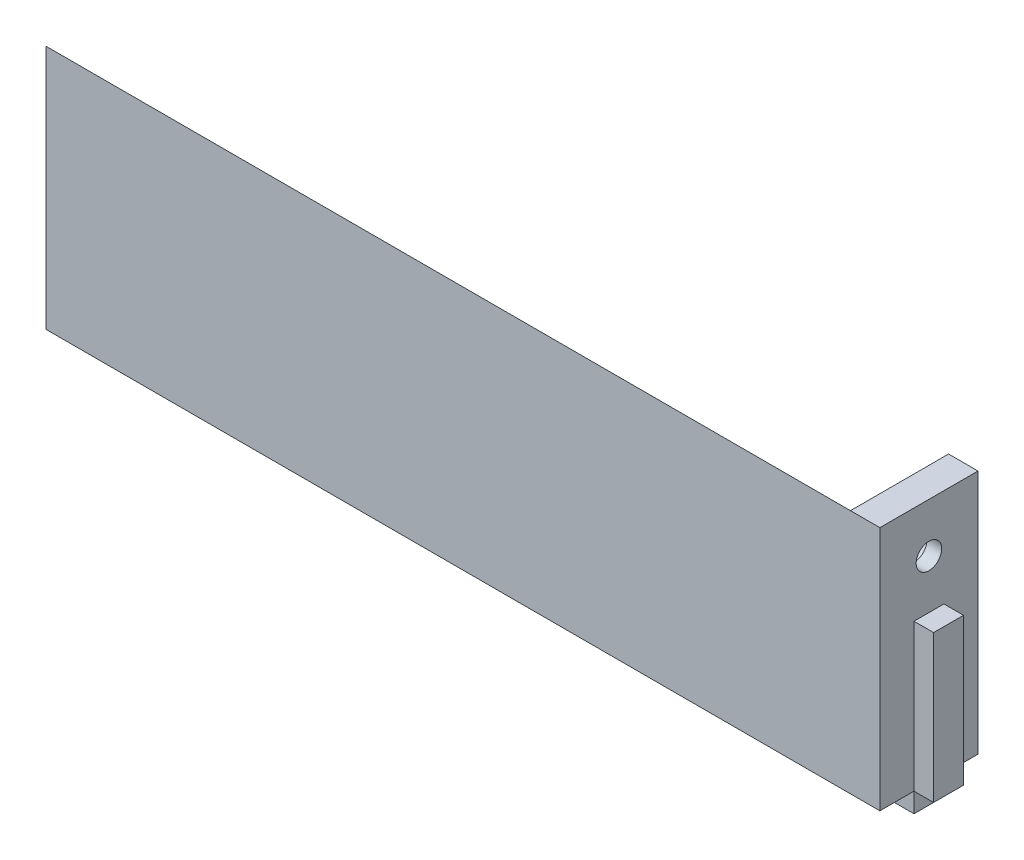
ISO-10303-21;
HEADER;
FILE_DESCRIPTION(('STEP AP214'),'2;1');
FILE_NAME('part.step','',(''),(''),'','','');
FILE_SCHEMA(('AUTOMOTIVE_DESIGN { 1 0 10303 214 1 1 1 1 }'));
ENDSEC;
DATA;
#1=APPLICATION_CONTEXT('core data for automotive mechanical design processes');
#2=APPLICATION_PROTOCOL_DEFINITION('international standard','automotive_design',2000,#1);
#3=PRODUCT_CONTEXT('',#1,'mechanical');
#4=PRODUCT('Part','Part','',(#3));
#5=PRODUCT_RELATED_PRODUCT_CATEGORY('part','',(#4));
#6=PRODUCT_DEFINITION_FORMATION('','',#4);
#7=PRODUCT_DEFINITION_CONTEXT('part definition',#1,'design');
#8=PRODUCT_DEFINITION('design','',#6,#7);
#9=PRODUCT_DEFINITION_SHAPE('','',#8);
#10=(LENGTH_UNIT() NAMED_UNIT(*) SI_UNIT(.MILLI.,.METRE.));
#11=(NAMED_UNIT(*) PLANE_ANGLE_UNIT() SI_UNIT($,.RADIAN.));
#12=(NAMED_UNIT(*) SI_UNIT($,.STERADIAN.) SOLID_ANGLE_UNIT());
#13=UNCERTAINTY_MEASURE_WITH_UNIT(LENGTH_MEASURE(1.E-05),#10,'distance_accuracy_value','');
#14=(GEOMETRIC_REPRESENTATION_CONTEXT(3) GLOBAL_UNCERTAINTY_ASSIGNED_CONTEXT((#13)) GLOBAL_UNIT_ASSIGNED_CONTEXT((#10,
#11,#12)) REPRESENTATION_CONTEXT('',''));
#15=CARTESIAN_POINT('',(0.,0.,0.));
#16=DIRECTION('',(0.,0.,1.));
#17=DIRECTION('',(1.,0.,0.));
#18=AXIS2_PLACEMENT_3D('',#15,#16,#17);
#19=CARTESIAN_POINT('',(340.,50.,0.));
#20=DIRECTION('',(1.,0.,0.));
#21=DIRECTION('',(0.,0.,-1.));
#22=AXIS2_PLACEMENT_3D('',#19,#20,#21);
#23=PLANE('',#22);
#24=DIRECTION('',(0.,1.,0.));
#25=VECTOR('',#24,1.);
#26=CARTESIAN_POINT('',(340.,0.,-13.05));
#27=LINE('',#26,#25);
#28=CARTESIAN_POINT('',(340.,0.,-13.05));
#29=VERTEX_POINT('',#28);
#30=CARTESIAN_POINT('',(340.,30.,-13.05));
#31=VERTEX_POINT('',#30);
#32=EDGE_CURVE('E180',#29,#31,#27,.T.);
#33=ORIENTED_EDGE('',*,*,#32,.F.);
#34=DIRECTION('',(0.,0.,1.));
#35=VECTOR('',#34,1.);
#36=CARTESIAN_POINT('',(340.,0.,0.));
#37=LINE('',#36,#35);
#38=CARTESIAN_POINT('',(340.,0.,-20.));
#39=VERTEX_POINT('',#38);
#40=EDGE_CURVE('E325',#39,#29,#37,.T.);
#41=ORIENTED_EDGE('',*,*,#40,.F.);
#42=DIRECTION('',(0.,-1.,0.));
#43=VECTOR('',#42,1.);
#44=CARTESIAN_POINT('',(340.,50.,-20.));
#45=LINE('',#44,#43);
#46=CARTESIAN_POINT('',(340.,50.,-20.));
#47=VERTEX_POINT('',#46);
#48=EDGE_CURVE('E334',#47,#39,#45,.T.);
#49=ORIENTED_EDGE('',*,*,#48,.F.);
#50=DIRECTION('',(0.,0.,1.));
#51=VECTOR('',#50,1.);
#52=CARTESIAN_POINT('',(340.,50.,0.));
#53=LINE('',#52,#51);
#54=CARTESIAN_POINT('',(340.,50.,0.));
#55=VERTEX_POINT('',#54);
#56=EDGE_CURVE('E312',#47,#55,#53,.T.);
#57=ORIENTED_EDGE('',*,*,#56,.T.);
#58=DIRECTION('',(0.,-1.,0.));
#59=VECTOR('',#58,1.);
#60=CARTESIAN_POINT('',(340.,50.,0.));
#61=LINE('',#60,#59);
#62=CARTESIAN_POINT('',(340.,0.,0.));
#63=VERTEX_POINT('',#62);
#64=EDGE_CURVE('E324',#55,#63,#61,.T.);
#65=ORIENTED_EDGE('',*,*,#64,.T.);
#66=CARTESIAN_POINT('',(340.,0.,-6.95));
#67=VERTEX_POINT('',#66);
#68=EDGE_CURVE('E311',#67,#63,#37,.T.);
#69=ORIENTED_EDGE('',*,*,#68,.F.);
#70=DIRECTION('',(0.,-1.,0.));
#71=VECTOR('',#70,1.);
#72=CARTESIAN_POINT('',(340.,0.,-6.95));
#73=LINE('',#72,#71);
#74=CARTESIAN_POINT('',(340.,30.,-6.95));
#75=VERTEX_POINT('',#74);
#76=EDGE_CURVE('E371',#75,#67,#73,.T.);
#77=ORIENTED_EDGE('',*,*,#76,.F.);
#78=DIRECTION('',(0.,0.,1.));
#79=VECTOR('',#78,1.);
#80=CARTESIAN_POINT('',(340.,30.,-13.05));
#81=LINE('',#80,#79);
#82=EDGE_CURVE('E57',#31,#75,#81,.T.);
#83=ORIENTED_EDGE('',*,*,#82,.F.);
#84=EDGE_LOOP('',(#33,#41,#49,#57,#65,#69,#77,#83));
#85=FACE_BOUND('',#84,.T.);
#86=CARTESIAN_POINT('',(340.,40.,-10.));
#87=DIRECTION('',(1.,0.,0.));
#88=DIRECTION('',(0.,0.,-1.));
#89=AXIS2_PLACEMENT_3D('',#86,#87,#88);
#90=CIRCLE('',#89,2.6);
#91=CARTESIAN_POINT('',(340.,40.,-12.6));
#92=VERTEX_POINT('',#91);
#93=EDGE_CURVE('E284',#92,#92,#90,.T.);
#94=ORIENTED_EDGE('',*,*,#93,.F.);
#95=EDGE_LOOP('',(#94));
#96=FACE_BOUND('',#95,.T.);
#97=ADVANCED_FACE('F41',(#85,#96),#23,.T.);
#98=CARTESIAN_POINT('',(231.37,400.,-10.));
#99=DIRECTION('',(0.,-1.,0.));
#100=DIRECTION('',(0.,0.,-1.));
#101=AXIS2_PLACEMENT_3D('',#98,#99,#100);
#102=CYLINDRICAL_SURFACE('',#101,4.99999999999999);
#103=CARTESIAN_POINT('',(231.37,25.,-10.));
#104=DIRECTION('',(0.,-0.371390676354104,0.928476690885259));
#105=DIRECTION('',(0.,-0.928476690885259,-0.371390676354104));
#106=AXIS2_PLACEMENT_3D('',#103,#104,#105);
#107=ELLIPSE('',#106,13.4629120178362,4.99999999999999);
#108=CARTESIAN_POINT('',(231.37,12.5,-15.));
#109=VERTEX_POINT('',#108);
#110=EDGE_CURVE('E270',#109,#109,#107,.T.);
#111=ORIENTED_EDGE('',*,*,#110,.F.);
#112=EDGE_LOOP('',(#111));
#113=FACE_BOUND('',#112,.T.);
#114=CARTESIAN_POINT('',(231.37,3.,-10.));
#115=DIRECTION('',(0.,-1.,0.));
#116=DIRECTION('',(0.,0.,-1.));
#117=AXIS2_PLACEMENT_3D('',#114,#115,#116);
#118=CIRCLE('',#117,4.99999999999999);
#119=CARTESIAN_POINT('',(231.37,3.,-15.));
#120=VERTEX_POINT('',#119);
#121=EDGE_CURVE('E11',#120,#120,#118,.F.);
#122=ORIENTED_EDGE('',*,*,#121,.F.);
#123=EDGE_LOOP('',(#122));
#124=FACE_BOUND('',#123,.T.);
#125=ADVANCED_FACE('F415',(#113,#124),#102,.F.);
#126=CARTESIAN_POINT('',(0.,50.,0.));
#127=DIRECTION('',(0.,0.,-1.));
#128=DIRECTION('',(-1.,0.,0.));
#129=AXIS2_PLACEMENT_3D('',#126,#127,#128);
#130=PLANE('',#129);
#131=DIRECTION('',(1.,0.,0.));
#132=VECTOR('',#131,1.);
#133=CARTESIAN_POINT('',(6.00000000000001,50.,0.));
#134=LINE('',#133,#132);
#135=CARTESIAN_POINT('',(170.,50.,0.));
#136=VERTEX_POINT('',#135);
#137=CARTESIAN_POINT('',(334.,50.,0.));
#138=VERTEX_POINT('',#137);
#139=EDGE_CURVE('E338',#136,#138,#134,.T.);
#140=ORIENTED_EDGE('',*,*,#139,.F.);
#141=DIRECTION('',(0.,-1.,0.));
#142=VECTOR('',#141,1.);
#143=CARTESIAN_POINT('',(170.,400.,0.));
#144=LINE('',#143,#142);
#145=CARTESIAN_POINT('',(170.,0.,0.));
#146=VERTEX_POINT('',#145);
#147=EDGE_CURVE('E278',#136,#146,#144,.T.);
#148=ORIENTED_EDGE('',*,*,#147,.T.);
#149=DIRECTION('',(1.,0.,0.));
#150=VECTOR('',#149,1.);
#151=CARTESIAN_POINT('',(0.,0.,0.));
#152=LINE('',#151,#150);
#153=EDGE_CURVE('E341',#146,#63,#152,.T.);
#154=ORIENTED_EDGE('',*,*,#153,.T.);
#155=ORIENTED_EDGE('',*,*,#64,.F.);
#156=DIRECTION('',(-1.,0.,0.));
#157=VECTOR('',#156,1.);
#158=CARTESIAN_POINT('',(340.,50.,0.));
#159=LINE('',#158,#157);
#160=EDGE_CURVE('E320',#55,#138,#159,.T.);
#161=ORIENTED_EDGE('',*,*,#160,.T.);
#162=EDGE_LOOP('',(#140,#148,#154,#155,#161));
#163=FACE_BOUND('',#162,.T.);
#164=ADVANCED_FACE('F43',(#163),#130,.F.);
#165=CARTESIAN_POINT('',(0.,0.,0.));
#166=DIRECTION('',(0.,-1.,0.));
#167=DIRECTION('',(0.,0.,-1.));
#168=AXIS2_PLACEMENT_3D('',#165,#166,#167);
#169=PLANE('',#168);
#170=DIRECTION('',(1.,0.,0.));
#171=VECTOR('',#170,1.);
#172=CARTESIAN_POINT('',(0.,0.,-6.95));
#173=LINE('',#172,#171);
#174=CARTESIAN_POINT('',(260.,0.,-6.95));
#175=VERTEX_POINT('',#174);
#176=EDGE_CURVE('E182',#175,#67,#173,.T.);
#177=ORIENTED_EDGE('',*,*,#176,.T.);
#178=ORIENTED_EDGE('',*,*,#68,.T.);
#179=ORIENTED_EDGE('',*,*,#153,.F.);
#180=DIRECTION('',(0.,0.,1.));
#181=VECTOR('',#180,1.);
#182=CARTESIAN_POINT('',(170.,0.,0.));
#183=LINE('',#182,#181);
#184=CARTESIAN_POINT('',(170.,0.,-6.95));
#185=VERTEX_POINT('',#184);
#186=EDGE_CURVE('E279',#185,#146,#183,.T.);
#187=ORIENTED_EDGE('',*,*,#186,.F.);
#188=DIRECTION('',(1.,0.,0.));
#189=VECTOR('',#188,1.);
#190=CARTESIAN_POINT('',(0.,0.,-6.95));
#191=LINE('',#190,#189);
#192=CARTESIAN_POINT('',(205.,0.,-6.95));
#193=VERTEX_POINT('',#192);
#194=EDGE_CURVE('E246',#185,#193,#191,.T.);
#195=ORIENTED_EDGE('',*,*,#194,.T.);
#196=DIRECTION('',(0.,0.,-1.));
#197=VECTOR('',#196,1.);
#198=CARTESIAN_POINT('',(205.,0.,0.));
#199=LINE('',#198,#197);
#200=CARTESIAN_POINT('',(205.,0.,-13.05));
#201=VERTEX_POINT('',#200);
#202=EDGE_CURVE('E226',#193,#201,#199,.T.);
#203=ORIENTED_EDGE('',*,*,#202,.T.);
#204=DIRECTION('',(1.,0.,0.));
#205=VECTOR('',#204,1.);
#206=CARTESIAN_POINT('',(0.,0.,-13.05));
#207=LINE('',#206,#205);
#208=CARTESIAN_POINT('',(170.,0.,-13.05));
#209=VERTEX_POINT('',#208);
#210=EDGE_CURVE('E232',#209,#201,#207,.T.);
#211=ORIENTED_EDGE('',*,*,#210,.F.);
#212=CARTESIAN_POINT('',(170.,0.,-20.));
#213=VERTEX_POINT('',#212);
#214=EDGE_CURVE('E274',#213,#209,#183,.T.);
#215=ORIENTED_EDGE('',*,*,#214,.F.);
#216=DIRECTION('',(-1.,0.,0.));
#217=VECTOR('',#216,1.);
#218=CARTESIAN_POINT('',(0.,0.,-20.));
#219=LINE('',#218,#217);
#220=CARTESIAN_POINT('',(334.,0.,-20.));
#221=VERTEX_POINT('',#220);
#222=EDGE_CURVE('E345',#221,#213,#219,.T.);
#223=ORIENTED_EDGE('',*,*,#222,.F.);
#224=DIRECTION('',(1.,0.,0.));
#225=VECTOR('',#224,1.);
#226=CARTESIAN_POINT('',(340.,0.,-20.));
#227=LINE('',#226,#225);
#228=EDGE_CURVE('E317',#221,#39,#227,.T.);
#229=ORIENTED_EDGE('',*,*,#228,.T.);
#230=ORIENTED_EDGE('',*,*,#40,.T.);
#231=DIRECTION('',(1.,0.,0.));
#232=VECTOR('',#231,1.);
#233=CARTESIAN_POINT('',(0.,0.,-13.05));
#234=LINE('',#233,#232);
#235=CARTESIAN_POINT('',(260.,0.,-13.05));
#236=VERTEX_POINT('',#235);
#237=EDGE_CURVE('E196',#236,#29,#234,.T.);
#238=ORIENTED_EDGE('',*,*,#237,.F.);
#239=DIRECTION('',(0.,0.,1.));
#240=VECTOR('',#239,1.);
#241=CARTESIAN_POINT('',(260.,0.,0.));
#242=LINE('',#241,#240);
#243=EDGE_CURVE('E65',#236,#175,#242,.T.);
#244=ORIENTED_EDGE('',*,*,#243,.T.);
#245=EDGE_LOOP('',(#177,#178,#179,#187,#195,#203,#211,#215,#223,#229,#230,#238,#244));
#246=FACE_BOUND('',#245,.T.);
#247=CARTESIAN_POINT('',(231.37,0.,-10.));
#248=DIRECTION('',(0.,-1.,0.));
#249=DIRECTION('',(0.,0.,-1.));
#250=AXIS2_PLACEMENT_3D('',#247,#248,#249);
#251=CIRCLE('',#250,2.59999999999999);
#252=CARTESIAN_POINT('',(231.37,0.,-12.6));
#253=VERTEX_POINT('',#252);
#254=EDGE_CURVE('E265',#253,#253,#251,.T.);
#255=ORIENTED_EDGE('',*,*,#254,.F.);
#256=EDGE_LOOP('',(#255));
#257=FACE_BOUND('',#256,.T.);
#258=ADVANCED_FACE('F364',(#246,#257),#169,.T.);
#259=CARTESIAN_POINT('',(6.00000000000001,50.,0.));
#260=DIRECTION('',(0.,-0.371390676354104,0.928476690885259));
#261=DIRECTION('',(0.,-0.928476690885259,-0.371390676354104));
#262=AXIS2_PLACEMENT_3D('',#259,#260,#261);
#263=PLANE('',#262);
#264=ORIENTED_EDGE('',*,*,#110,.T.);
#265=EDGE_LOOP('',(#264));
#266=FACE_BOUND('',#265,.T.);
#267=ORIENTED_EDGE('',*,*,#222,.T.);
#268=DIRECTION('',(0.,0.928476690885259,0.371390676354104));
#269=VECTOR('',#268,1.);
#270=CARTESIAN_POINT('',(170.,50.,0.));
#271=LINE('',#270,#269);
#272=EDGE_CURVE('E50',#213,#136,#271,.T.);
#273=ORIENTED_EDGE('',*,*,#272,.T.);
#274=ORIENTED_EDGE('',*,*,#139,.T.);
#275=DIRECTION('',(0.,-0.928476690885259,-0.371390676354104));
#276=VECTOR('',#275,1.);
#277=CARTESIAN_POINT('',(334.,50.,0.));
#278=LINE('',#277,#276);
#279=EDGE_CURVE('E307',#138,#221,#278,.T.);
#280=ORIENTED_EDGE('',*,*,#279,.T.);
#281=EDGE_LOOP('',(#267,#273,#274,#280));
#282=FACE_BOUND('',#281,.T.);
#283=ADVANCED_FACE('F389',(#266,#282),#263,.F.);
#284=DIRECTION('',(0.,0.,-1.));
#285=VECTOR('',#284,1.);
#286=CARTESIAN_POINT('',(340.,0.,-13.05));
#287=LINE('',#286,#285);
#288=EDGE_CURVE('E177',#67,#29,#287,.T.);
#289=ORIENTED_EDGE('',*,*,#288,.F.);
#290=DIRECTION('',(0.,1.,0.));
#291=VECTOR('',#290,1.);
#292=CARTESIAN_POINT('',(340.,-4.,-6.95));
#293=LINE('',#292,#291);
#294=CARTESIAN_POINT('',(340.,-4.,-6.95));
#295=VERTEX_POINT('',#294);
#296=EDGE_CURVE('E205',#295,#67,#293,.T.);
#297=ORIENTED_EDGE('',*,*,#296,.F.);
#298=DIRECTION('',(0.,0.,1.));
#299=VECTOR('',#298,1.);
#300=CARTESIAN_POINT('',(340.,-4.,0.));
#301=LINE('',#300,#299);
#302=CARTESIAN_POINT('',(340.,-4.,-13.05));
#303=VERTEX_POINT('',#302);
#304=EDGE_CURVE('E203',#303,#295,#301,.T.);
#305=ORIENTED_EDGE('',*,*,#304,.F.);
#306=DIRECTION('',(0.,1.,0.));
#307=VECTOR('',#306,1.);
#308=CARTESIAN_POINT('',(340.,-4.,-13.05));
#309=LINE('',#308,#307);
#310=EDGE_CURVE('E215',#303,#29,#309,.T.);
#311=ORIENTED_EDGE('',*,*,#310,.T.);
#312=EDGE_LOOP('',(#289,#297,#305,#311));
#313=FACE_BOUND('',#312,.T.);
#314=ADVANCED_FACE('F417',(#313),#23,.T.);
#315=CARTESIAN_POINT('',(340.,50.,-20.));
#316=DIRECTION('',(0.,0.,-1.));
#317=DIRECTION('',(-1.,0.,0.));
#318=AXIS2_PLACEMENT_3D('',#315,#316,#317);
#319=PLANE('',#318);
#320=DIRECTION('',(0.,1.,0.));
#321=VECTOR('',#320,1.);
#322=CARTESIAN_POINT('',(334.,0.,-20.));
#323=LINE('',#322,#321);
#324=CARTESIAN_POINT('',(334.,50.,-20.));
#325=VERTEX_POINT('',#324);
#326=EDGE_CURVE('E303',#221,#325,#323,.T.);
#327=ORIENTED_EDGE('',*,*,#326,.T.);
#328=DIRECTION('',(1.,0.,0.));
#329=VECTOR('',#328,1.);
#330=CARTESIAN_POINT('',(340.,50.,-20.));
#331=LINE('',#330,#329);
#332=EDGE_CURVE('E316',#325,#47,#331,.T.);
#333=ORIENTED_EDGE('',*,*,#332,.T.);
#334=ORIENTED_EDGE('',*,*,#48,.T.);
#335=ORIENTED_EDGE('',*,*,#228,.F.);
#336=EDGE_LOOP('',(#327,#333,#334,#335));
#337=FACE_BOUND('',#336,.T.);
#338=ADVANCED_FACE('F384',(#337),#319,.T.);
#339=CARTESIAN_POINT('',(340.,50.,0.));
#340=DIRECTION('',(0.,-1.,0.));
#341=DIRECTION('',(0.,0.,-1.));
#342=AXIS2_PLACEMENT_3D('',#339,#340,#341);
#343=PLANE('',#342);
#344=ORIENTED_EDGE('',*,*,#332,.F.);
#345=DIRECTION('',(0.,0.,1.));
#346=VECTOR('',#345,1.);
#347=CARTESIAN_POINT('',(334.,50.,-20.));
#348=LINE('',#347,#346);
#349=EDGE_CURVE('E296',#325,#138,#348,.T.);
#350=ORIENTED_EDGE('',*,*,#349,.T.);
#351=ORIENTED_EDGE('',*,*,#160,.F.);
#352=ORIENTED_EDGE('',*,*,#56,.F.);
#353=EDGE_LOOP('',(#344,#350,#351,#352));
#354=FACE_BOUND('',#353,.T.);
#355=ADVANCED_FACE('F377',(#354),#343,.F.);
#356=CARTESIAN_POINT('',(334.,0.,0.));
#357=DIRECTION('',(1.,0.,0.));
#358=DIRECTION('',(0.,0.,1.));
#359=AXIS2_PLACEMENT_3D('',#356,#357,#358);
#360=PLANE('',#359);
#361=CARTESIAN_POINT('',(334.,40.,-10.));
#362=DIRECTION('',(1.,0.,0.));
#363=DIRECTION('',(0.,0.,-1.));
#364=AXIS2_PLACEMENT_3D('',#361,#362,#363);
#365=CIRCLE('',#364,5.);
#366=CARTESIAN_POINT('',(334.,40.,-15.));
#367=VERTEX_POINT('',#366);
#368=EDGE_CURVE('E288',#367,#367,#365,.T.);
#369=ORIENTED_EDGE('',*,*,#368,.T.);
#370=EDGE_LOOP('',(#369));
#371=FACE_BOUND('',#370,.T.);
#372=ORIENTED_EDGE('',*,*,#349,.F.);
#373=ORIENTED_EDGE('',*,*,#326,.F.);
#374=ORIENTED_EDGE('',*,*,#279,.F.);
#375=EDGE_LOOP('',(#372,#373,#374));
#376=FACE_BOUND('',#375,.T.);
#377=ADVANCED_FACE('F381',(#371,#376),#360,.F.);
#378=CARTESIAN_POINT('',(337.,40.,-10.));
#379=DIRECTION('',(-1.,0.,0.));
#380=DIRECTION('',(0.,0.,1.));
#381=AXIS2_PLACEMENT_3D('',#378,#379,#380);
#382=CYLINDRICAL_SURFACE('',#381,5.);
#383=CARTESIAN_POINT('',(337.,40.,-10.));
#384=DIRECTION('',(1.,0.,0.));
#385=DIRECTION('',(0.,0.,-1.));
#386=AXIS2_PLACEMENT_3D('',#383,#384,#385);
#387=CIRCLE('',#386,5.);
#388=CARTESIAN_POINT('',(337.,40.,-15.));
#389=VERTEX_POINT('',#388);
#390=EDGE_CURVE('E292',#389,#389,#387,.T.);
#391=ORIENTED_EDGE('',*,*,#390,.T.);
#392=EDGE_LOOP('',(#391));
#393=FACE_BOUND('',#392,.T.);
#394=ORIENTED_EDGE('',*,*,#368,.F.);
#395=EDGE_LOOP('',(#394));
#396=FACE_BOUND('',#395,.T.);
#397=ADVANCED_FACE('F675',(#393,#396),#382,.F.);
#398=CARTESIAN_POINT('',(337.,0.,0.));
#399=DIRECTION('',(-1.,0.,0.));
#400=DIRECTION('',(0.,0.,-1.));
#401=AXIS2_PLACEMENT_3D('',#398,#399,#400);
#402=PLANE('',#401);
#403=CARTESIAN_POINT('',(337.,40.,-10.));
#404=DIRECTION('',(1.,0.,0.));
#405=DIRECTION('',(0.,0.,-1.));
#406=AXIS2_PLACEMENT_3D('',#403,#404,#405);
#407=CIRCLE('',#406,2.6);
#408=CARTESIAN_POINT('',(337.,40.,-12.6));
#409=VERTEX_POINT('',#408);
#410=EDGE_CURVE('E283',#409,#409,#407,.T.);
#411=ORIENTED_EDGE('',*,*,#410,.T.);
#412=EDGE_LOOP('',(#411));
#413=FACE_BOUND('',#412,.T.);
#414=ORIENTED_EDGE('',*,*,#390,.F.);
#415=EDGE_LOOP('',(#414));
#416=FACE_BOUND('',#415,.T.);
#417=ADVANCED_FACE('F665',(#413,#416),#402,.T.);
#418=CARTESIAN_POINT('',(340.,40.,-10.));
#419=DIRECTION('',(-1.,0.,0.));
#420=DIRECTION('',(0.,0.,1.));
#421=AXIS2_PLACEMENT_3D('',#418,#419,#420);
#422=CYLINDRICAL_SURFACE('',#421,2.6);
#423=ORIENTED_EDGE('',*,*,#93,.T.);
#424=EDGE_LOOP('',(#423));
#425=FACE_BOUND('',#424,.T.);
#426=ORIENTED_EDGE('',*,*,#410,.F.);
#427=EDGE_LOOP('',(#426));
#428=FACE_BOUND('',#427,.T.);
#429=ADVANCED_FACE('F576',(#425,#428),#422,.F.);
#430=CARTESIAN_POINT('',(170.,400.,0.));
#431=DIRECTION('',(1.,0.,0.));
#432=DIRECTION('',(0.,0.,-1.));
#433=AXIS2_PLACEMENT_3D('',#430,#431,#432);
#434=PLANE('',#433);
#435=ORIENTED_EDGE('',*,*,#214,.T.);
#436=DIRECTION('',(0.,1.,0.));
#437=VECTOR('',#436,1.);
#438=CARTESIAN_POINT('',(170.,-4.,-13.05));
#439=LINE('',#438,#437);
#440=CARTESIAN_POINT('',(170.,-4.,-13.05));
#441=VERTEX_POINT('',#440);
#442=EDGE_CURVE('E255',#441,#209,#439,.T.);
#443=ORIENTED_EDGE('',*,*,#442,.F.);
#444=DIRECTION('',(0.,0.,-1.));
#445=VECTOR('',#444,1.);
#446=CARTESIAN_POINT('',(170.,-4.,0.));
#447=LINE('',#446,#445);
#448=CARTESIAN_POINT('',(170.,-4.,-6.95));
#449=VERTEX_POINT('',#448);
#450=EDGE_CURVE('E236',#449,#441,#447,.T.);
#451=ORIENTED_EDGE('',*,*,#450,.F.);
#452=DIRECTION('',(0.,1.,0.));
#453=VECTOR('',#452,1.);
#454=CARTESIAN_POINT('',(170.,-4.,-6.95));
#455=LINE('',#454,#453);
#456=EDGE_CURVE('E258',#449,#185,#455,.T.);
#457=ORIENTED_EDGE('',*,*,#456,.T.);
#458=ORIENTED_EDGE('',*,*,#186,.T.);
#459=ORIENTED_EDGE('',*,*,#147,.F.);
#460=ORIENTED_EDGE('',*,*,#272,.F.);
#461=EDGE_LOOP('',(#435,#443,#451,#457,#458,#459,#460));
#462=FACE_BOUND('',#461,.T.);
#463=ADVANCED_FACE('F358',(#462),#434,.F.);
#464=CARTESIAN_POINT('',(231.37,3.,-10.));
#465=DIRECTION('',(0.,-1.,0.));
#466=DIRECTION('',(0.,0.,-1.));
#467=AXIS2_PLACEMENT_3D('',#464,#465,#466);
#468=PLANE('',#467);
#469=CARTESIAN_POINT('',(231.37,3.,-10.));
#470=DIRECTION('',(0.,-1.,0.));
#471=DIRECTION('',(0.,0.,-1.));
#472=AXIS2_PLACEMENT_3D('',#469,#470,#471);
#473=CIRCLE('',#472,2.59999999999999);
#474=CARTESIAN_POINT('',(231.37,3.,-12.6));
#475=VERTEX_POINT('',#474);
#476=EDGE_CURVE('E266',#475,#475,#473,.T.);
#477=ORIENTED_EDGE('',*,*,#476,.T.);
#478=EDGE_LOOP('',(#477));
#479=FACE_BOUND('',#478,.T.);
#480=ORIENTED_EDGE('',*,*,#121,.T.);
#481=EDGE_LOOP('',(#480));
#482=FACE_BOUND('',#481,.T.);
#483=ADVANCED_FACE('F411',(#479,#482),#468,.F.);
#484=CARTESIAN_POINT('',(231.37,3.,-10.));
#485=DIRECTION('',(0.,-1.,0.));
#486=DIRECTION('',(0.,0.,-1.));
#487=AXIS2_PLACEMENT_3D('',#484,#485,#486);
#488=CYLINDRICAL_SURFACE('',#487,2.59999999999999);
#489=ORIENTED_EDGE('',*,*,#476,.F.);
#490=EDGE_LOOP('',(#489));
#491=FACE_BOUND('',#490,.T.);
#492=ORIENTED_EDGE('',*,*,#254,.T.);
#493=EDGE_LOOP('',(#492));
#494=FACE_BOUND('',#493,.T.);
#495=ADVANCED_FACE('F404',(#491,#494),#488,.F.);
#496=CARTESIAN_POINT('',(205.,-4.,0.));
#497=DIRECTION('',(1.,0.,0.));
#498=DIRECTION('',(0.,0.,-1.));
#499=AXIS2_PLACEMENT_3D('',#496,#497,#498);
#500=PLANE('',#499);
#501=ORIENTED_EDGE('',*,*,#202,.F.);
#502=DIRECTION('',(0.,1.,0.));
#503=VECTOR('',#502,1.);
#504=CARTESIAN_POINT('',(205.,-4.,-6.95));
#505=LINE('',#504,#503);
#506=CARTESIAN_POINT('',(205.,-4.,-6.95));
#507=VERTEX_POINT('',#506);
#508=EDGE_CURVE('E261',#507,#193,#505,.T.);
#509=ORIENTED_EDGE('',*,*,#508,.F.);
#510=DIRECTION('',(0.,0.,-1.));
#511=VECTOR('',#510,1.);
#512=CARTESIAN_POINT('',(205.,-4.,0.));
#513=LINE('',#512,#511);
#514=CARTESIAN_POINT('',(205.,-4.,-13.05));
#515=VERTEX_POINT('',#514);
#516=EDGE_CURVE('E227',#507,#515,#513,.T.);
#517=ORIENTED_EDGE('',*,*,#516,.T.);
#518=DIRECTION('',(0.,1.,0.));
#519=VECTOR('',#518,1.);
#520=CARTESIAN_POINT('',(205.,-4.,-13.05));
#521=LINE('',#520,#519);
#522=EDGE_CURVE('E242',#515,#201,#521,.T.);
#523=ORIENTED_EDGE('',*,*,#522,.T.);
#524=EDGE_LOOP('',(#501,#509,#517,#523));
#525=FACE_BOUND('',#524,.T.);
#526=ADVANCED_FACE('F402',(#525),#500,.T.);
#527=CARTESIAN_POINT('',(0.,-4.,-6.95));
#528=DIRECTION('',(0.,0.,1.));
#529=DIRECTION('',(1.,0.,0.));
#530=AXIS2_PLACEMENT_3D('',#527,#528,#529);
#531=PLANE('',#530);
#532=ORIENTED_EDGE('',*,*,#194,.F.);
#533=ORIENTED_EDGE('',*,*,#456,.F.);
#534=DIRECTION('',(1.,0.,0.));
#535=VECTOR('',#534,1.);
#536=CARTESIAN_POINT('',(0.,-4.,-6.95));
#537=LINE('',#536,#535);
#538=EDGE_CURVE('E231',#449,#507,#537,.T.);
#539=ORIENTED_EDGE('',*,*,#538,.T.);
#540=ORIENTED_EDGE('',*,*,#508,.T.);
#541=EDGE_LOOP('',(#532,#533,#539,#540));
#542=FACE_BOUND('',#541,.T.);
#543=ADVANCED_FACE('F400',(#542),#531,.T.);
#544=CARTESIAN_POINT('',(0.,-4.,-13.05));
#545=DIRECTION('',(0.,0.,1.));
#546=DIRECTION('',(1.,0.,0.));
#547=AXIS2_PLACEMENT_3D('',#544,#545,#546);
#548=PLANE('',#547);
#549=ORIENTED_EDGE('',*,*,#210,.T.);
#550=ORIENTED_EDGE('',*,*,#522,.F.);
#551=DIRECTION('',(1.,0.,0.));
#552=VECTOR('',#551,1.);
#553=CARTESIAN_POINT('',(0.,-4.,-13.05));
#554=LINE('',#553,#552);
#555=EDGE_CURVE('E239',#441,#515,#554,.T.);
#556=ORIENTED_EDGE('',*,*,#555,.F.);
#557=ORIENTED_EDGE('',*,*,#442,.T.);
#558=EDGE_LOOP('',(#549,#550,#556,#557));
#559=FACE_BOUND('',#558,.T.);
#560=ADVANCED_FACE('F395',(#559),#548,.F.);
#561=CARTESIAN_POINT('',(0.,-4.,0.));
#562=DIRECTION('',(0.,-1.,0.));
#563=DIRECTION('',(0.,0.,-1.));
#564=AXIS2_PLACEMENT_3D('',#561,#562,#563);
#565=PLANE('',#564);
#566=ORIENTED_EDGE('',*,*,#516,.F.);
#567=ORIENTED_EDGE('',*,*,#538,.F.);
#568=ORIENTED_EDGE('',*,*,#450,.T.);
#569=ORIENTED_EDGE('',*,*,#555,.T.);
#570=EDGE_LOOP('',(#566,#567,#568,#569));
#571=FACE_BOUND('',#570,.T.);
#572=ADVANCED_FACE('F398',(#571),#565,.T.);
#573=CARTESIAN_POINT('',(0.,-4.,-6.95));
#574=DIRECTION('',(0.,0.,1.));
#575=DIRECTION('',(1.,0.,0.));
#576=AXIS2_PLACEMENT_3D('',#573,#574,#575);
#577=PLANE('',#576);
#578=ORIENTED_EDGE('',*,*,#176,.F.);
#579=DIRECTION('',(0.,1.,0.));
#580=VECTOR('',#579,1.);
#581=CARTESIAN_POINT('',(260.,-4.,-6.95));
#582=LINE('',#581,#580);
#583=CARTESIAN_POINT('',(260.,-4.,-6.95));
#584=VERTEX_POINT('',#583);
#585=EDGE_CURVE('E223',#584,#175,#582,.T.);
#586=ORIENTED_EDGE('',*,*,#585,.F.);
#587=DIRECTION('',(1.,0.,0.));
#588=VECTOR('',#587,1.);
#589=CARTESIAN_POINT('',(0.,-4.,-6.95));
#590=LINE('',#589,#588);
#591=EDGE_CURVE('E191',#584,#295,#590,.T.);
#592=ORIENTED_EDGE('',*,*,#591,.T.);
#593=ORIENTED_EDGE('',*,*,#296,.T.);
#594=EDGE_LOOP('',(#578,#586,#592,#593));
#595=FACE_BOUND('',#594,.T.);
#596=ADVANCED_FACE('F480',(#595),#577,.T.);
#597=CARTESIAN_POINT('',(260.,-4.,0.));
#598=DIRECTION('',(-1.,0.,0.));
#599=DIRECTION('',(0.,0.,1.));
#600=AXIS2_PLACEMENT_3D('',#597,#598,#599);
#601=PLANE('',#600);
#602=ORIENTED_EDGE('',*,*,#243,.F.);
#603=DIRECTION('',(0.,1.,0.));
#604=VECTOR('',#603,1.);
#605=CARTESIAN_POINT('',(260.,-4.,-13.05));
#606=LINE('',#605,#604);
#607=CARTESIAN_POINT('',(260.,-4.,-13.05));
#608=VERTEX_POINT('',#607);
#609=EDGE_CURVE('E219',#608,#236,#606,.T.);
#610=ORIENTED_EDGE('',*,*,#609,.F.);
#611=DIRECTION('',(0.,0.,1.));
#612=VECTOR('',#611,1.);
#613=CARTESIAN_POINT('',(260.,-4.,0.));
#614=LINE('',#613,#612);
#615=EDGE_CURVE('E195',#608,#584,#614,.T.);
#616=ORIENTED_EDGE('',*,*,#615,.T.);
#617=ORIENTED_EDGE('',*,*,#585,.T.);
#618=EDGE_LOOP('',(#602,#610,#616,#617));
#619=FACE_BOUND('',#618,.T.);
#620=ADVANCED_FACE('F476',(#619),#601,.T.);
#621=CARTESIAN_POINT('',(0.,-4.,-13.05));
#622=DIRECTION('',(0.,0.,1.));
#623=DIRECTION('',(1.,0.,0.));
#624=AXIS2_PLACEMENT_3D('',#621,#622,#623);
#625=PLANE('',#624);
#626=ORIENTED_EDGE('',*,*,#237,.T.);
#627=ORIENTED_EDGE('',*,*,#310,.F.);
#628=DIRECTION('',(1.,0.,0.));
#629=VECTOR('',#628,1.);
#630=CARTESIAN_POINT('',(0.,-4.,-13.05));
#631=LINE('',#630,#629);
#632=EDGE_CURVE('E200',#608,#303,#631,.T.);
#633=ORIENTED_EDGE('',*,*,#632,.F.);
#634=ORIENTED_EDGE('',*,*,#609,.T.);
#635=EDGE_LOOP('',(#626,#627,#633,#634));
#636=FACE_BOUND('',#635,.T.);
#637=ADVANCED_FACE('F472',(#636),#625,.F.);
#638=CARTESIAN_POINT('',(0.,-4.,0.));
#639=DIRECTION('',(0.,-1.,0.));
#640=DIRECTION('',(0.,0.,-1.));
#641=AXIS2_PLACEMENT_3D('',#638,#639,#640);
#642=PLANE('',#641);
#643=ORIENTED_EDGE('',*,*,#591,.F.);
#644=ORIENTED_EDGE('',*,*,#615,.F.);
#645=ORIENTED_EDGE('',*,*,#632,.T.);
#646=ORIENTED_EDGE('',*,*,#304,.T.);
#647=EDGE_LOOP('',(#643,#644,#645,#646));
#648=FACE_BOUND('',#647,.T.);
#649=ADVANCED_FACE('F469',(#648),#642,.T.);
#650=CARTESIAN_POINT('',(344.,0.,-13.05));
#651=DIRECTION('',(0.,0.,1.));
#652=DIRECTION('',(1.,0.,0.));
#653=AXIS2_PLACEMENT_3D('',#650,#651,#652);
#654=PLANE('',#653);
#655=ORIENTED_EDGE('',*,*,#32,.T.);
#656=DIRECTION('',(-1.,0.,0.));
#657=VECTOR('',#656,1.);
#658=CARTESIAN_POINT('',(344.,30.,-13.05));
#659=LINE('',#658,#657);
#660=CARTESIAN_POINT('',(344.,30.,-13.05));
#661=VERTEX_POINT('',#660);
#662=EDGE_CURVE('E159',#661,#31,#659,.T.);
#663=ORIENTED_EDGE('',*,*,#662,.F.);
#664=DIRECTION('',(0.,1.,0.));
#665=VECTOR('',#664,1.);
#666=CARTESIAN_POINT('',(344.,0.,-13.05));
#667=LINE('',#666,#665);
#668=CARTESIAN_POINT('',(344.,0.,-13.05));
#669=VERTEX_POINT('',#668);
#670=EDGE_CURVE('E167',#669,#661,#667,.T.);
#671=ORIENTED_EDGE('',*,*,#670,.F.);
#672=DIRECTION('',(-1.,0.,0.));
#673=VECTOR('',#672,1.);
#674=CARTESIAN_POINT('',(344.,0.,-13.05));
#675=LINE('',#674,#673);
#676=EDGE_CURVE('E443',#669,#29,#675,.T.);
#677=ORIENTED_EDGE('',*,*,#676,.T.);
#678=EDGE_LOOP('',(#655,#663,#671,#677));
#679=FACE_BOUND('',#678,.T.);
#680=ADVANCED_FACE('F179',(#679),#654,.F.);
#681=CARTESIAN_POINT('',(344.,30.,-13.05));
#682=DIRECTION('',(0.,-1.,0.));
#683=DIRECTION('',(0.,0.,-1.));
#684=AXIS2_PLACEMENT_3D('',#681,#682,#683);
#685=PLANE('',#684);
#686=ORIENTED_EDGE('',*,*,#82,.T.);
#687=DIRECTION('',(-1.,0.,0.));
#688=VECTOR('',#687,1.);
#689=CARTESIAN_POINT('',(344.,30.,-6.95));
#690=LINE('',#689,#688);
#691=CARTESIAN_POINT('',(344.,30.,-6.95));
#692=VERTEX_POINT('',#691);
#693=EDGE_CURVE('E162',#692,#75,#690,.T.);
#694=ORIENTED_EDGE('',*,*,#693,.F.);
#695=DIRECTION('',(0.,0.,1.));
#696=VECTOR('',#695,1.);
#697=CARTESIAN_POINT('',(344.,30.,-13.05));
#698=LINE('',#697,#696);
#699=EDGE_CURVE('E155',#661,#692,#698,.T.);
#700=ORIENTED_EDGE('',*,*,#699,.F.);
#701=ORIENTED_EDGE('',*,*,#662,.T.);
#702=EDGE_LOOP('',(#686,#694,#700,#701));
#703=FACE_BOUND('',#702,.T.);
#704=ADVANCED_FACE('F157',(#703),#685,.F.);
#705=CARTESIAN_POINT('',(344.,0.,-6.95));
#706=DIRECTION('',(0.,0.,-1.));
#707=DIRECTION('',(-1.,0.,0.));
#708=AXIS2_PLACEMENT_3D('',#705,#706,#707);
#709=PLANE('',#708);
#710=ORIENTED_EDGE('',*,*,#76,.T.);
#711=DIRECTION('',(-1.,0.,0.));
#712=VECTOR('',#711,1.);
#713=CARTESIAN_POINT('',(344.,0.,-6.95));
#714=LINE('',#713,#712);
#715=CARTESIAN_POINT('',(344.,0.,-6.95));
#716=VERTEX_POINT('',#715);
#717=EDGE_CURVE('E187',#716,#67,#714,.T.);
#718=ORIENTED_EDGE('',*,*,#717,.F.);
#719=DIRECTION('',(0.,-1.,0.));
#720=VECTOR('',#719,1.);
#721=CARTESIAN_POINT('',(344.,0.,-6.95));
#722=LINE('',#721,#720);
#723=EDGE_CURVE('E166',#692,#716,#722,.T.);
#724=ORIENTED_EDGE('',*,*,#723,.F.);
#725=ORIENTED_EDGE('',*,*,#693,.T.);
#726=EDGE_LOOP('',(#710,#718,#724,#725));
#727=FACE_BOUND('',#726,.T.);
#728=ADVANCED_FACE('F449',(#727),#709,.F.);
#729=CARTESIAN_POINT('',(344.,0.,-13.05));
#730=DIRECTION('',(0.,1.,0.));
#731=DIRECTION('',(0.,0.,1.));
#732=AXIS2_PLACEMENT_3D('',#729,#730,#731);
#733=PLANE('',#732);
#734=ORIENTED_EDGE('',*,*,#288,.T.);
#735=ORIENTED_EDGE('',*,*,#676,.F.);
#736=DIRECTION('',(0.,0.,-1.));
#737=VECTOR('',#736,1.);
#738=CARTESIAN_POINT('',(344.,0.,-13.05));
#739=LINE('',#738,#737);
#740=EDGE_CURVE('E172',#716,#669,#739,.T.);
#741=ORIENTED_EDGE('',*,*,#740,.F.);
#742=ORIENTED_EDGE('',*,*,#717,.T.);
#743=EDGE_LOOP('',(#734,#735,#741,#742));
#744=FACE_BOUND('',#743,.T.);
#745=ADVANCED_FACE('F447',(#744),#733,.F.);
#746=CARTESIAN_POINT('',(344.,0.,0.));
#747=DIRECTION('',(1.,0.,0.));
#748=DIRECTION('',(0.,0.,-1.));
#749=AXIS2_PLACEMENT_3D('',#746,#747,#748);
#750=PLANE('',#749);
#751=ORIENTED_EDGE('',*,*,#670,.T.);
#752=ORIENTED_EDGE('',*,*,#699,.T.);
#753=ORIENTED_EDGE('',*,*,#723,.T.);
#754=ORIENTED_EDGE('',*,*,#740,.T.);
#755=EDGE_LOOP('',(#751,#752,#753,#754));
#756=FACE_BOUND('',#755,.T.);
#757=ADVANCED_FACE('F170',(#756),#750,.T.);
#758=CLOSED_SHELL('',(#97,#125,#164,#258,#283,#314,#338,#355,#377,#397,#417,#429,#463,#483,#495,
#526,#543,#560,#572,#596,#620,#637,#649,#680,#704,#728,#745,#757));
#759=MANIFOLD_SOLID_BREP('B2',#758);
#760=ADVANCED_BREP_SHAPE_REPRESENTATION('',(#18,#759),#14);
#761=SHAPE_DEFINITION_REPRESENTATION(#9,#760);
ENDSEC;
END-ISO-10303-21;
